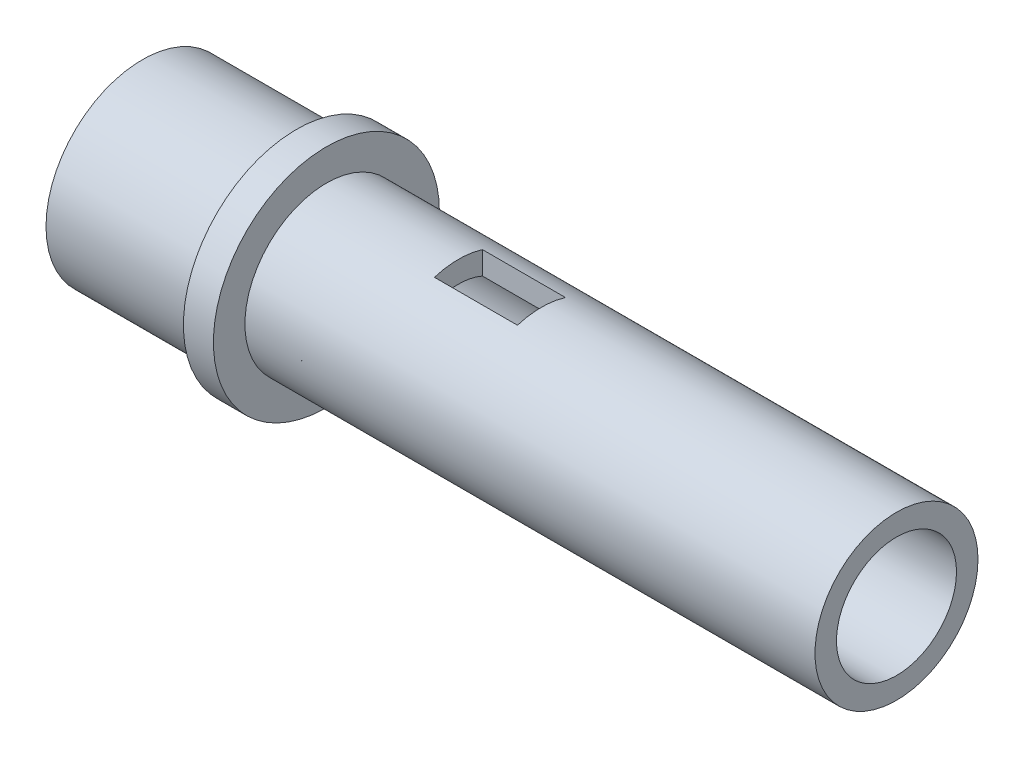
ISO-10303-21;
HEADER;
FILE_DESCRIPTION(('STEP AP214'),'2;1');
FILE_NAME('part.step','',(''),(''),'','','');
FILE_SCHEMA(('AUTOMOTIVE_DESIGN { 1 0 10303 214 1 1 1 1 }'));
ENDSEC;
DATA;
#1=APPLICATION_CONTEXT('core data for automotive mechanical design processes');
#2=APPLICATION_PROTOCOL_DEFINITION('international standard','automotive_design',2000,#1);
#3=PRODUCT_CONTEXT('',#1,'mechanical');
#4=PRODUCT('Part','Part','',(#3));
#5=PRODUCT_RELATED_PRODUCT_CATEGORY('part','',(#4));
#6=PRODUCT_DEFINITION_FORMATION('','',#4);
#7=PRODUCT_DEFINITION_CONTEXT('part definition',#1,'design');
#8=PRODUCT_DEFINITION('design','',#6,#7);
#9=PRODUCT_DEFINITION_SHAPE('','',#8);
#10=(LENGTH_UNIT() NAMED_UNIT(*) SI_UNIT(.MILLI.,.METRE.));
#11=(NAMED_UNIT(*) PLANE_ANGLE_UNIT() SI_UNIT($,.RADIAN.));
#12=(NAMED_UNIT(*) SI_UNIT($,.STERADIAN.) SOLID_ANGLE_UNIT());
#13=UNCERTAINTY_MEASURE_WITH_UNIT(LENGTH_MEASURE(1.E-05),#10,'distance_accuracy_value','');
#14=(GEOMETRIC_REPRESENTATION_CONTEXT(3) GLOBAL_UNCERTAINTY_ASSIGNED_CONTEXT((#13)) GLOBAL_UNIT_ASSIGNED_CONTEXT((#10,
#11,#12)) REPRESENTATION_CONTEXT('',''));
#15=CARTESIAN_POINT('',(0.,0.,0.));
#16=DIRECTION('',(0.,0.,1.));
#17=DIRECTION('',(1.,0.,0.));
#18=AXIS2_PLACEMENT_3D('',#15,#16,#17);
#19=CARTESIAN_POINT('',(0.,0.,0.));
#20=DIRECTION('',(1.,0.,0.));
#21=DIRECTION('',(0.,0.,-1.));
#22=AXIS2_PLACEMENT_3D('',#19,#20,#21);
#23=CYLINDRICAL_SURFACE('',#22,3.);
#24=CARTESIAN_POINT('',(7.7,0.,0.));
#25=DIRECTION('',(-1.,0.,0.));
#26=DIRECTION('',(0.,0.,1.));
#27=AXIS2_PLACEMENT_3D('',#24,#25,#26);
#28=CIRCLE('',#27,3.);
#29=CARTESIAN_POINT('',(7.7,0.,3.));
#30=VERTEX_POINT('',#29);
#31=EDGE_CURVE('E94',#30,#30,#28,.F.);
#32=ORIENTED_EDGE('',*,*,#31,.F.);
#33=EDGE_LOOP('',(#32));
#34=FACE_BOUND('',#33,.T.);
#35=CARTESIAN_POINT('',(37.7,0.,0.));
#36=DIRECTION('',(1.,0.,0.));
#37=DIRECTION('',(0.,0.,-1.));
#38=AXIS2_PLACEMENT_3D('',#35,#36,#37);
#39=CIRCLE('',#38,3.);
#40=CARTESIAN_POINT('',(37.7,0.,-3.));
#41=VERTEX_POINT('',#40);
#42=EDGE_CURVE('E97',#41,#41,#39,.T.);
#43=ORIENTED_EDGE('',*,*,#42,.T.);
#44=EDGE_LOOP('',(#43));
#45=FACE_BOUND('',#44,.T.);
#46=CARTESIAN_POINT('',(19.95,0.,0.));
#47=DIRECTION('',(-1.,0.,0.));
#48=DIRECTION('',(0.,0.,1.));
#49=AXIS2_PLACEMENT_3D('',#46,#47,#48);
#50=CIRCLE('',#49,3.);
#51=CARTESIAN_POINT('',(19.95,2.7495454169735,-1.2));
#52=VERTEX_POINT('',#51);
#53=CARTESIAN_POINT('',(19.95,2.7495454169735,1.2));
#54=VERTEX_POINT('',#53);
#55=EDGE_CURVE('E84',#52,#54,#50,.F.);
#56=ORIENTED_EDGE('',*,*,#55,.F.);
#57=DIRECTION('',(1.,0.,0.));
#58=VECTOR('',#57,1.);
#59=CARTESIAN_POINT('',(0.,2.7495454169735,-1.2));
#60=LINE('',#59,#58);
#61=CARTESIAN_POINT('',(15.8,2.7495454169735,-1.2));
#62=VERTEX_POINT('',#61);
#63=EDGE_CURVE('E124',#62,#52,#60,.T.);
#64=ORIENTED_EDGE('',*,*,#63,.F.);
#65=CARTESIAN_POINT('',(15.8,0.,0.));
#66=DIRECTION('',(1.,0.,0.));
#67=DIRECTION('',(0.,0.,-1.));
#68=AXIS2_PLACEMENT_3D('',#65,#66,#67);
#69=CIRCLE('',#68,3.);
#70=CARTESIAN_POINT('',(15.8,2.74954541697351,1.2));
#71=VERTEX_POINT('',#70);
#72=EDGE_CURVE('E126',#71,#62,#69,.F.);
#73=ORIENTED_EDGE('',*,*,#72,.F.);
#74=DIRECTION('',(1.,0.,0.));
#75=VECTOR('',#74,1.);
#76=CARTESIAN_POINT('',(0.,2.7495454169735,1.2));
#77=LINE('',#76,#75);
#78=EDGE_CURVE('E128',#54,#71,#77,.F.);
#79=ORIENTED_EDGE('',*,*,#78,.F.);
#80=EDGE_LOOP('',(#56,#64,#73,#79));
#81=FACE_BOUND('',#80,.T.);
#82=ADVANCED_FACE('F34',(#34,#45,#81),#23,.F.);
#83=CARTESIAN_POINT('',(37.7,0.,0.));
#84=DIRECTION('',(-1.,0.,0.));
#85=DIRECTION('',(0.,0.,1.));
#86=AXIS2_PLACEMENT_3D('',#83,#84,#85);
#87=CYLINDRICAL_SURFACE('',#86,4.075);
#88=CARTESIAN_POINT('',(9.2,0.,0.));
#89=DIRECTION('',(1.,0.,0.));
#90=DIRECTION('',(0.,0.,-1.));
#91=AXIS2_PLACEMENT_3D('',#88,#89,#90);
#92=CIRCLE('',#91,4.075);
#93=CARTESIAN_POINT('',(9.2,0.,-4.075));
#94=VERTEX_POINT('',#93);
#95=EDGE_CURVE('E77',#94,#94,#92,.T.);
#96=ORIENTED_EDGE('',*,*,#95,.T.);
#97=EDGE_LOOP('',(#96));
#98=FACE_BOUND('',#97,.T.);
#99=CARTESIAN_POINT('',(37.7,0.,0.));
#100=DIRECTION('',(1.,0.,0.));
#101=DIRECTION('',(0.,0.,-1.));
#102=AXIS2_PLACEMENT_3D('',#99,#100,#101);
#103=CIRCLE('',#102,4.075);
#104=CARTESIAN_POINT('',(37.7,0.,-4.075));
#105=VERTEX_POINT('',#104);
#106=EDGE_CURVE('E109',#105,#105,#103,.T.);
#107=ORIENTED_EDGE('',*,*,#106,.F.);
#108=EDGE_LOOP('',(#107));
#109=FACE_BOUND('',#108,.T.);
#110=CARTESIAN_POINT('',(19.95,0.,0.));
#111=DIRECTION('',(-1.,0.,0.));
#112=DIRECTION('',(0.,0.,1.));
#113=AXIS2_PLACEMENT_3D('',#110,#111,#112);
#114=CIRCLE('',#113,4.075);
#115=CARTESIAN_POINT('',(19.95,3.894306741899,1.2));
#116=VERTEX_POINT('',#115);
#117=CARTESIAN_POINT('',(19.95,3.894306741899,-1.2));
#118=VERTEX_POINT('',#117);
#119=EDGE_CURVE('E11',#116,#118,#114,.T.);
#120=ORIENTED_EDGE('',*,*,#119,.F.);
#121=DIRECTION('',(-1.,0.,0.));
#122=VECTOR('',#121,1.);
#123=CARTESIAN_POINT('',(37.7,3.894306741899,1.2));
#124=LINE('',#123,#122);
#125=CARTESIAN_POINT('',(15.8,3.894306741899,1.2));
#126=VERTEX_POINT('',#125);
#127=EDGE_CURVE('E71',#126,#116,#124,.F.);
#128=ORIENTED_EDGE('',*,*,#127,.F.);
#129=CARTESIAN_POINT('',(15.8,0.,0.));
#130=DIRECTION('',(1.,0.,0.));
#131=DIRECTION('',(0.,0.,-1.));
#132=AXIS2_PLACEMENT_3D('',#129,#130,#131);
#133=CIRCLE('',#132,4.075);
#134=CARTESIAN_POINT('',(15.8,3.894306741899,-1.2));
#135=VERTEX_POINT('',#134);
#136=EDGE_CURVE('E76',#135,#126,#133,.T.);
#137=ORIENTED_EDGE('',*,*,#136,.F.);
#138=DIRECTION('',(-1.,0.,0.));
#139=VECTOR('',#138,1.);
#140=CARTESIAN_POINT('',(37.7,3.894306741899,-1.2));
#141=LINE('',#140,#139);
#142=EDGE_CURVE('E42',#118,#135,#141,.T.);
#143=ORIENTED_EDGE('',*,*,#142,.F.);
#144=EDGE_LOOP('',(#120,#128,#137,#143));
#145=FACE_BOUND('',#144,.T.);
#146=ADVANCED_FACE('F88',(#98,#109,#145),#87,.T.);
#147=CARTESIAN_POINT('',(7.7,0.,0.));
#148=DIRECTION('',(-1.,0.,0.));
#149=DIRECTION('',(0.,0.,1.));
#150=AXIS2_PLACEMENT_3D('',#147,#148,#149);
#151=CYLINDRICAL_SURFACE('',#150,4.82);
#152=CARTESIAN_POINT('',(7.7,0.,0.));
#153=DIRECTION('',(1.,0.,0.));
#154=DIRECTION('',(0.,0.,-1.));
#155=AXIS2_PLACEMENT_3D('',#152,#153,#154);
#156=CIRCLE('',#155,4.82);
#157=CARTESIAN_POINT('',(7.7,0.,4.82));
#158=VERTEX_POINT('',#157);
#159=EDGE_CURVE('E102',#158,#158,#156,.T.);
#160=CARTESIAN_POINT('',(0.,0.,0.));
#161=DIRECTION('',(1.,0.,0.));
#162=DIRECTION('',(0.,0.,-1.));
#163=AXIS2_PLACEMENT_3D('',#160,#161,#162);
#164=CIRCLE('',#163,4.82);
#165=CARTESIAN_POINT('',(0.,0.,4.82));
#166=VERTEX_POINT('',#165);
#167=EDGE_CURVE('E99',#166,#166,#164,.T.);
#168=CARTESIAN_POINT('',(7.7,0.,4.82));
#169=CARTESIAN_POINT('',(7.61979166666667,0.,4.82));
#170=CARTESIAN_POINT('',(7.53958333333333,0.,4.82));
#171=CARTESIAN_POINT('',(7.37916666666667,0.,4.82));
#172=CARTESIAN_POINT('',(7.29895833333333,0.,4.82));
#173=CARTESIAN_POINT('',(7.13854166666667,0.,4.82));
#174=CARTESIAN_POINT('',(7.05833333333333,0.,4.82));
#175=CARTESIAN_POINT('',(6.89791666666667,0.,4.82));
#176=CARTESIAN_POINT('',(6.81770833333333,0.,4.82));
#177=CARTESIAN_POINT('',(6.65729166666667,0.,4.82));
#178=CARTESIAN_POINT('',(6.57708333333333,0.,4.82));
#179=CARTESIAN_POINT('',(6.41666666666667,0.,4.82));
#180=CARTESIAN_POINT('',(6.33645833333333,0.,4.82));
#181=CARTESIAN_POINT('',(6.17604166666667,0.,4.82));
#182=CARTESIAN_POINT('',(6.09583333333333,0.,4.82));
#183=CARTESIAN_POINT('',(5.93541666666667,0.,4.82));
#184=CARTESIAN_POINT('',(5.85520833333333,0.,4.82));
#185=CARTESIAN_POINT('',(5.69479166666667,0.,4.82));
#186=CARTESIAN_POINT('',(5.61458333333333,0.,4.82));
#187=CARTESIAN_POINT('',(5.45416666666667,0.,4.82));
#188=CARTESIAN_POINT('',(5.37395833333333,0.,4.82));
#189=CARTESIAN_POINT('',(5.21354166666667,0.,4.82));
#190=CARTESIAN_POINT('',(5.13333333333333,0.,4.82));
#191=CARTESIAN_POINT('',(4.97291666666667,0.,4.82));
#192=CARTESIAN_POINT('',(4.89270833333333,0.,4.82));
#193=CARTESIAN_POINT('',(4.73229166666667,0.,4.82));
#194=CARTESIAN_POINT('',(4.65208333333333,0.,4.82));
#195=CARTESIAN_POINT('',(4.49166666666667,0.,4.82));
#196=CARTESIAN_POINT('',(4.41145833333333,0.,4.82));
#197=CARTESIAN_POINT('',(4.25104166666667,0.,4.82));
#198=CARTESIAN_POINT('',(4.17083333333333,0.,4.82));
#199=CARTESIAN_POINT('',(4.01041666666667,0.,4.82));
#200=CARTESIAN_POINT('',(3.93020833333333,0.,4.82));
#201=CARTESIAN_POINT('',(3.76979166666667,0.,4.82));
#202=CARTESIAN_POINT('',(3.68958333333333,0.,4.82));
#203=CARTESIAN_POINT('',(3.52916666666667,0.,4.82));
#204=CARTESIAN_POINT('',(3.44895833333333,0.,4.82));
#205=CARTESIAN_POINT('',(3.28854166666667,0.,4.82));
#206=CARTESIAN_POINT('',(3.20833333333333,0.,4.82));
#207=CARTESIAN_POINT('',(3.04791666666667,0.,4.82));
#208=CARTESIAN_POINT('',(2.96770833333333,0.,4.82));
#209=CARTESIAN_POINT('',(2.80729166666667,0.,4.82));
#210=CARTESIAN_POINT('',(2.72708333333333,0.,4.82));
#211=CARTESIAN_POINT('',(2.56666666666667,0.,4.82));
#212=CARTESIAN_POINT('',(2.48645833333333,0.,4.82));
#213=CARTESIAN_POINT('',(2.32604166666667,0.,4.82));
#214=CARTESIAN_POINT('',(2.24583333333333,0.,4.82));
#215=CARTESIAN_POINT('',(2.08541666666667,0.,4.82));
#216=CARTESIAN_POINT('',(2.00520833333333,0.,4.82));
#217=CARTESIAN_POINT('',(1.84479166666667,0.,4.82));
#218=CARTESIAN_POINT('',(1.76458333333333,0.,4.82));
#219=CARTESIAN_POINT('',(1.60416666666667,0.,4.82));
#220=CARTESIAN_POINT('',(1.52395833333333,0.,4.82));
#221=CARTESIAN_POINT('',(1.36354166666667,0.,4.82));
#222=CARTESIAN_POINT('',(1.28333333333333,0.,4.82));
#223=CARTESIAN_POINT('',(1.12291666666667,0.,4.82));
#224=CARTESIAN_POINT('',(1.04270833333333,0.,4.82));
#225=CARTESIAN_POINT('',(0.882291666666666,0.,4.82));
#226=CARTESIAN_POINT('',(0.802083333333333,0.,4.82));
#227=CARTESIAN_POINT('',(0.641666666666666,0.,4.82));
#228=CARTESIAN_POINT('',(0.561458333333332,0.,4.82));
#229=CARTESIAN_POINT('',(0.401041666666666,0.,4.82));
#230=CARTESIAN_POINT('',(0.320833333333333,0.,4.82));
#231=CARTESIAN_POINT('',(0.160416666666666,0.,4.82));
#232=CARTESIAN_POINT('',(0.0802083333333325,0.,4.82));
#233=CARTESIAN_POINT('',(0.,0.,4.82));
#234=B_SPLINE_CURVE_WITH_KNOTS('',3,(#168,#169,#170,#171,#172,#173,#174,#175,#176,#177,#178,
#179,#180,#181,#182,#183,#184,#185,#186,#187,#188,#189,#190,#191,#192,#193,#194,#195,#196,#197,
#198,#199,#200,#201,#202,#203,#204,#205,#206,#207,#208,#209,#210,#211,#212,#213,#214,#215,#216,
#217,#218,#219,#220,#221,#222,#223,#224,#225,#226,#227,#228,#229,#230,#231,#232,#233),
.UNSPECIFIED.,.F.,.F.,(4,2,2,2,2,2,2,2,2,2,2,2,2,2,2,2,2,2,2,2,2,2,2,2,2,2,2,2,2,2,2,2,4),(0.,
0.240625,0.48125,0.721874999999999,0.9625,1.203125,1.44375,1.684375,1.925,2.165625,2.40625,
2.646875,2.8875,3.128125,3.36875,3.609375,3.85,4.090625,4.33125,4.571875,4.8125,5.053125,
5.29375,5.534375,5.775,6.015625,6.25625,6.496875,6.7375,6.978125,7.21875,7.459375,7.7),.UNSPECIFIED.);
#235=EDGE_CURVE('BSEAM36',#158,#166,#234,.T.);
#236=ORIENTED_EDGE('',*,*,#159,.F.);
#237=ORIENTED_EDGE('',*,*,#167,.T.);
#238=ORIENTED_EDGE('',*,*,#235,.T.);
#239=ORIENTED_EDGE('',*,*,#235,.F.);
#240=EDGE_LOOP('',(#236,#238,#237,#239));
#241=FACE_BOUND('',#240,.T.);
#242=ADVANCED_FACE('F36',(#241),#151,.T.);
#243=CARTESIAN_POINT('',(0.,0.,0.));
#244=DIRECTION('',(1.,0.,0.));
#245=DIRECTION('',(0.,0.,-1.));
#246=AXIS2_PLACEMENT_3D('',#243,#244,#245);
#247=PLANE('',#246);
#248=CARTESIAN_POINT('',(0.,0.,0.));
#249=DIRECTION('',(-1.,0.,0.));
#250=DIRECTION('',(0.,0.,1.));
#251=AXIS2_PLACEMENT_3D('',#248,#249,#250);
#252=CIRCLE('',#251,3.95);
#253=CARTESIAN_POINT('',(0.,0.,3.95));
#254=VERTEX_POINT('',#253);
#255=EDGE_CURVE('E118',#254,#254,#252,.T.);
#256=ORIENTED_EDGE('',*,*,#255,.F.);
#257=EDGE_LOOP('',(#256));
#258=FACE_BOUND('',#257,.T.);
#259=ORIENTED_EDGE('',*,*,#167,.F.);
#260=EDGE_LOOP('',(#259));
#261=FACE_BOUND('',#260,.T.);
#262=ADVANCED_FACE('F177',(#258,#261),#247,.F.);
#263=CARTESIAN_POINT('',(9.2,0.,0.));
#264=DIRECTION('',(-1.,0.,0.));
#265=DIRECTION('',(0.,0.,1.));
#266=AXIS2_PLACEMENT_3D('',#263,#264,#265);
#267=CYLINDRICAL_SURFACE('',#266,5.65);
#268=CARTESIAN_POINT('',(9.2,0.,0.));
#269=DIRECTION('',(1.,0.,0.));
#270=DIRECTION('',(0.,0.,-1.));
#271=AXIS2_PLACEMENT_3D('',#268,#269,#270);
#272=CIRCLE('',#271,5.65);
#273=CARTESIAN_POINT('',(9.2,0.,-5.65));
#274=VERTEX_POINT('',#273);
#275=EDGE_CURVE('E103',#274,#274,#272,.T.);
#276=ORIENTED_EDGE('',*,*,#275,.F.);
#277=EDGE_LOOP('',(#276));
#278=FACE_BOUND('',#277,.T.);
#279=CARTESIAN_POINT('',(7.7,0.,0.));
#280=DIRECTION('',(1.,0.,0.));
#281=DIRECTION('',(0.,0.,-1.));
#282=AXIS2_PLACEMENT_3D('',#279,#280,#281);
#283=CIRCLE('',#282,5.65);
#284=CARTESIAN_POINT('',(7.7,0.,-5.65));
#285=VERTEX_POINT('',#284);
#286=EDGE_CURVE('E106',#285,#285,#283,.T.);
#287=ORIENTED_EDGE('',*,*,#286,.T.);
#288=EDGE_LOOP('',(#287));
#289=FACE_BOUND('',#288,.T.);
#290=ADVANCED_FACE('F171',(#278,#289),#267,.T.);
#291=CARTESIAN_POINT('',(9.2,0.,0.));
#292=DIRECTION('',(1.,0.,0.));
#293=DIRECTION('',(0.,0.,-1.));
#294=AXIS2_PLACEMENT_3D('',#291,#292,#293);
#295=PLANE('',#294);
#296=ORIENTED_EDGE('',*,*,#95,.F.);
#297=EDGE_LOOP('',(#296));
#298=FACE_BOUND('',#297,.T.);
#299=ORIENTED_EDGE('',*,*,#275,.T.);
#300=EDGE_LOOP('',(#299));
#301=FACE_BOUND('',#300,.T.);
#302=ADVANCED_FACE('F168',(#298,#301),#295,.T.);
#303=CARTESIAN_POINT('',(7.7,0.,0.));
#304=DIRECTION('',(1.,0.,0.));
#305=DIRECTION('',(0.,0.,-1.));
#306=AXIS2_PLACEMENT_3D('',#303,#304,#305);
#307=PLANE('',#306);
#308=ORIENTED_EDGE('',*,*,#159,.T.);
#309=EDGE_LOOP('',(#308));
#310=FACE_BOUND('',#309,.T.);
#311=ORIENTED_EDGE('',*,*,#286,.F.);
#312=EDGE_LOOP('',(#311));
#313=FACE_BOUND('',#312,.T.);
#314=ADVANCED_FACE('F165',(#310,#313),#307,.F.);
#315=CARTESIAN_POINT('',(37.7,0.,0.));
#316=DIRECTION('',(1.,0.,0.));
#317=DIRECTION('',(0.,0.,-1.));
#318=AXIS2_PLACEMENT_3D('',#315,#316,#317);
#319=PLANE('',#318);
#320=ORIENTED_EDGE('',*,*,#42,.F.);
#321=EDGE_LOOP('',(#320));
#322=FACE_BOUND('',#321,.T.);
#323=ORIENTED_EDGE('',*,*,#106,.T.);
#324=EDGE_LOOP('',(#323));
#325=FACE_BOUND('',#324,.T.);
#326=ADVANCED_FACE('F162',(#322,#325),#319,.T.);
#327=CARTESIAN_POINT('',(7.7,0.,0.));
#328=DIRECTION('',(-1.,0.,0.));
#329=DIRECTION('',(0.,0.,1.));
#330=AXIS2_PLACEMENT_3D('',#327,#328,#329);
#331=PLANE('',#330);
#332=CARTESIAN_POINT('',(7.7,0.,0.));
#333=DIRECTION('',(-1.,0.,0.));
#334=DIRECTION('',(0.,0.,1.));
#335=AXIS2_PLACEMENT_3D('',#332,#333,#334);
#336=CIRCLE('',#335,3.95);
#337=CARTESIAN_POINT('',(7.7,0.,3.95));
#338=VERTEX_POINT('',#337);
#339=EDGE_CURVE('E98',#338,#338,#336,.T.);
#340=ORIENTED_EDGE('',*,*,#339,.T.);
#341=EDGE_LOOP('',(#340));
#342=FACE_BOUND('',#341,.T.);
#343=ORIENTED_EDGE('',*,*,#31,.T.);
#344=EDGE_LOOP('',(#343));
#345=FACE_BOUND('',#344,.T.);
#346=ADVANCED_FACE('F164',(#342,#345),#331,.T.);
#347=CARTESIAN_POINT('',(7.7,0.,0.));
#348=DIRECTION('',(-1.,0.,0.));
#349=DIRECTION('',(0.,0.,1.));
#350=AXIS2_PLACEMENT_3D('',#347,#348,#349);
#351=CYLINDRICAL_SURFACE('',#350,3.95);
#352=CARTESIAN_POINT('',(7.7,0.,3.95));
#353=CARTESIAN_POINT('',(7.61979166666667,0.,3.95));
#354=CARTESIAN_POINT('',(7.53958333333333,0.,3.95));
#355=CARTESIAN_POINT('',(7.37916666666667,0.,3.95));
#356=CARTESIAN_POINT('',(7.29895833333333,0.,3.95));
#357=CARTESIAN_POINT('',(7.13854166666667,0.,3.95));
#358=CARTESIAN_POINT('',(7.05833333333333,0.,3.95));
#359=CARTESIAN_POINT('',(6.89791666666667,0.,3.95));
#360=CARTESIAN_POINT('',(6.81770833333333,0.,3.95));
#361=CARTESIAN_POINT('',(6.65729166666667,0.,3.95));
#362=CARTESIAN_POINT('',(6.57708333333333,0.,3.95));
#363=CARTESIAN_POINT('',(6.41666666666667,0.,3.95));
#364=CARTESIAN_POINT('',(6.33645833333333,0.,3.95));
#365=CARTESIAN_POINT('',(6.17604166666667,0.,3.95));
#366=CARTESIAN_POINT('',(6.09583333333333,0.,3.95));
#367=CARTESIAN_POINT('',(5.93541666666667,0.,3.95));
#368=CARTESIAN_POINT('',(5.85520833333333,0.,3.95));
#369=CARTESIAN_POINT('',(5.69479166666667,0.,3.95));
#370=CARTESIAN_POINT('',(5.61458333333333,0.,3.95));
#371=CARTESIAN_POINT('',(5.45416666666667,0.,3.95));
#372=CARTESIAN_POINT('',(5.37395833333333,0.,3.95));
#373=CARTESIAN_POINT('',(5.21354166666667,0.,3.95));
#374=CARTESIAN_POINT('',(5.13333333333333,0.,3.95));
#375=CARTESIAN_POINT('',(4.97291666666667,0.,3.95));
#376=CARTESIAN_POINT('',(4.89270833333333,0.,3.95));
#377=CARTESIAN_POINT('',(4.73229166666667,0.,3.95));
#378=CARTESIAN_POINT('',(4.65208333333333,0.,3.95));
#379=CARTESIAN_POINT('',(4.49166666666667,0.,3.95));
#380=CARTESIAN_POINT('',(4.41145833333333,0.,3.95));
#381=CARTESIAN_POINT('',(4.25104166666667,0.,3.95));
#382=CARTESIAN_POINT('',(4.17083333333333,0.,3.95));
#383=CARTESIAN_POINT('',(4.01041666666667,0.,3.95));
#384=CARTESIAN_POINT('',(3.93020833333333,0.,3.95));
#385=CARTESIAN_POINT('',(3.76979166666667,0.,3.95));
#386=CARTESIAN_POINT('',(3.68958333333333,0.,3.95));
#387=CARTESIAN_POINT('',(3.52916666666667,0.,3.95));
#388=CARTESIAN_POINT('',(3.44895833333333,0.,3.95));
#389=CARTESIAN_POINT('',(3.28854166666667,0.,3.95));
#390=CARTESIAN_POINT('',(3.20833333333333,0.,3.95));
#391=CARTESIAN_POINT('',(3.04791666666667,0.,3.95));
#392=CARTESIAN_POINT('',(2.96770833333333,0.,3.95));
#393=CARTESIAN_POINT('',(2.80729166666667,0.,3.95));
#394=CARTESIAN_POINT('',(2.72708333333333,0.,3.95));
#395=CARTESIAN_POINT('',(2.56666666666667,0.,3.95));
#396=CARTESIAN_POINT('',(2.48645833333333,0.,3.95));
#397=CARTESIAN_POINT('',(2.32604166666667,0.,3.95));
#398=CARTESIAN_POINT('',(2.24583333333333,0.,3.95));
#399=CARTESIAN_POINT('',(2.08541666666667,0.,3.95));
#400=CARTESIAN_POINT('',(2.00520833333333,0.,3.95));
#401=CARTESIAN_POINT('',(1.84479166666667,0.,3.95));
#402=CARTESIAN_POINT('',(1.76458333333333,0.,3.95));
#403=CARTESIAN_POINT('',(1.60416666666667,0.,3.95));
#404=CARTESIAN_POINT('',(1.52395833333333,0.,3.95));
#405=CARTESIAN_POINT('',(1.36354166666667,0.,3.95));
#406=CARTESIAN_POINT('',(1.28333333333333,0.,3.95));
#407=CARTESIAN_POINT('',(1.12291666666667,0.,3.95));
#408=CARTESIAN_POINT('',(1.04270833333333,0.,3.95));
#409=CARTESIAN_POINT('',(0.882291666666667,0.,3.95));
#410=CARTESIAN_POINT('',(0.802083333333334,0.,3.95));
#411=CARTESIAN_POINT('',(0.641666666666668,0.,3.95));
#412=CARTESIAN_POINT('',(0.561458333333334,0.,3.95));
#413=CARTESIAN_POINT('',(0.401041666666668,0.,3.95));
#414=CARTESIAN_POINT('',(0.320833333333334,0.,3.95));
#415=CARTESIAN_POINT('',(0.160416666666668,0.,3.95));
#416=CARTESIAN_POINT('',(0.0802083333333343,0.,3.95));
#417=CARTESIAN_POINT('',(0.,0.,3.95));
#418=B_SPLINE_CURVE_WITH_KNOTS('',3,(#352,#353,#354,#355,#356,#357,#358,#359,#360,#361,#362,
#363,#364,#365,#366,#367,#368,#369,#370,#371,#372,#373,#374,#375,#376,#377,#378,#379,#380,#381,
#382,#383,#384,#385,#386,#387,#388,#389,#390,#391,#392,#393,#394,#395,#396,#397,#398,#399,#400,
#401,#402,#403,#404,#405,#406,#407,#408,#409,#410,#411,#412,#413,#414,#415,#416,#417),
.UNSPECIFIED.,.F.,.F.,(4,2,2,2,2,2,2,2,2,2,2,2,2,2,2,2,2,2,2,2,2,2,2,2,2,2,2,2,2,2,2,2,4),(0.,
0.240625,0.481250000000001,0.721875,0.962500000000001,1.203125,1.44375,1.684375,1.925,2.165625,
2.40625,2.646875,2.8875,3.128125,3.36875,3.609375,3.85,4.090625,4.33125,4.571875,4.8125,
5.053125,5.29375,5.534375,5.775,6.015625,6.25625,6.496875,6.7375,6.978125,7.21875,7.459375,7.7),.UNSPECIFIED.);
#419=EDGE_CURVE('BSEAM147',#338,#254,#418,.T.);
#420=ORIENTED_EDGE('',*,*,#339,.F.);
#421=ORIENTED_EDGE('',*,*,#255,.T.);
#422=ORIENTED_EDGE('',*,*,#419,.T.);
#423=ORIENTED_EDGE('',*,*,#419,.F.);
#424=EDGE_LOOP('',(#420,#422,#421,#423));
#425=FACE_BOUND('',#424,.T.);
#426=ADVANCED_FACE('F147',(#425),#351,.F.);
#427=CARTESIAN_POINT('',(19.95,7.7,1.2));
#428=DIRECTION('',(-1.,0.,0.));
#429=DIRECTION('',(0.,0.,1.));
#430=AXIS2_PLACEMENT_3D('',#427,#428,#429);
#431=PLANE('',#430);
#432=ORIENTED_EDGE('',*,*,#55,.T.);
#433=DIRECTION('',(0.,-1.,0.));
#434=VECTOR('',#433,1.);
#435=CARTESIAN_POINT('',(19.95,7.7,1.2));
#436=LINE('',#435,#434);
#437=EDGE_CURVE('E49',#116,#54,#436,.T.);
#438=ORIENTED_EDGE('',*,*,#437,.F.);
#439=ORIENTED_EDGE('',*,*,#119,.T.);
#440=DIRECTION('',(0.,-1.,0.));
#441=VECTOR('',#440,1.);
#442=CARTESIAN_POINT('',(19.95,7.7,-1.2));
#443=LINE('',#442,#441);
#444=EDGE_CURVE('E130',#118,#52,#443,.T.);
#445=ORIENTED_EDGE('',*,*,#444,.T.);
#446=EDGE_LOOP('',(#432,#438,#439,#445));
#447=FACE_BOUND('',#446,.T.);
#448=ADVANCED_FACE('F80',(#447),#431,.T.);
#449=CARTESIAN_POINT('',(15.8,7.7,-1.2));
#450=DIRECTION('',(0.,0.,1.));
#451=DIRECTION('',(1.,0.,0.));
#452=AXIS2_PLACEMENT_3D('',#449,#450,#451);
#453=PLANE('',#452);
#454=ORIENTED_EDGE('',*,*,#63,.T.);
#455=ORIENTED_EDGE('',*,*,#444,.F.);
#456=ORIENTED_EDGE('',*,*,#142,.T.);
#457=DIRECTION('',(0.,-1.,0.));
#458=VECTOR('',#457,1.);
#459=CARTESIAN_POINT('',(15.8,7.7,-1.2));
#460=LINE('',#459,#458);
#461=EDGE_CURVE('E132',#135,#62,#460,.T.);
#462=ORIENTED_EDGE('',*,*,#461,.T.);
#463=EDGE_LOOP('',(#454,#455,#456,#462));
#464=FACE_BOUND('',#463,.T.);
#465=ADVANCED_FACE('F139',(#464),#453,.T.);
#466=CARTESIAN_POINT('',(15.8,7.7,1.2));
#467=DIRECTION('',(1.,0.,0.));
#468=DIRECTION('',(0.,0.,-1.));
#469=AXIS2_PLACEMENT_3D('',#466,#467,#468);
#470=PLANE('',#469);
#471=ORIENTED_EDGE('',*,*,#72,.T.);
#472=ORIENTED_EDGE('',*,*,#461,.F.);
#473=ORIENTED_EDGE('',*,*,#136,.T.);
#474=DIRECTION('',(0.,-1.,0.));
#475=VECTOR('',#474,1.);
#476=CARTESIAN_POINT('',(15.8,7.7,1.2));
#477=LINE('',#476,#475);
#478=EDGE_CURVE('E54',#126,#71,#477,.T.);
#479=ORIENTED_EDGE('',*,*,#478,.T.);
#480=EDGE_LOOP('',(#471,#472,#473,#479));
#481=FACE_BOUND('',#480,.T.);
#482=ADVANCED_FACE('F136',(#481),#470,.T.);
#483=CARTESIAN_POINT('',(15.8,7.7,1.2));
#484=DIRECTION('',(0.,0.,-1.));
#485=DIRECTION('',(-1.,0.,0.));
#486=AXIS2_PLACEMENT_3D('',#483,#484,#485);
#487=PLANE('',#486);
#488=ORIENTED_EDGE('',*,*,#78,.T.);
#489=ORIENTED_EDGE('',*,*,#478,.F.);
#490=ORIENTED_EDGE('',*,*,#127,.T.);
#491=ORIENTED_EDGE('',*,*,#437,.T.);
#492=EDGE_LOOP('',(#488,#489,#490,#491));
#493=FACE_BOUND('',#492,.T.);
#494=ADVANCED_FACE('F72',(#493),#487,.T.);
#495=CLOSED_SHELL('',(#82,#146,#242,#262,#290,#302,#314,#326,#346,#426,#448,#465,#482,#494));
#496=MANIFOLD_SOLID_BREP('B2',#495);
#497=ADVANCED_BREP_SHAPE_REPRESENTATION('',(#18,#496),#14);
#498=SHAPE_DEFINITION_REPRESENTATION(#9,#497);
ENDSEC;
END-ISO-10303-21;
